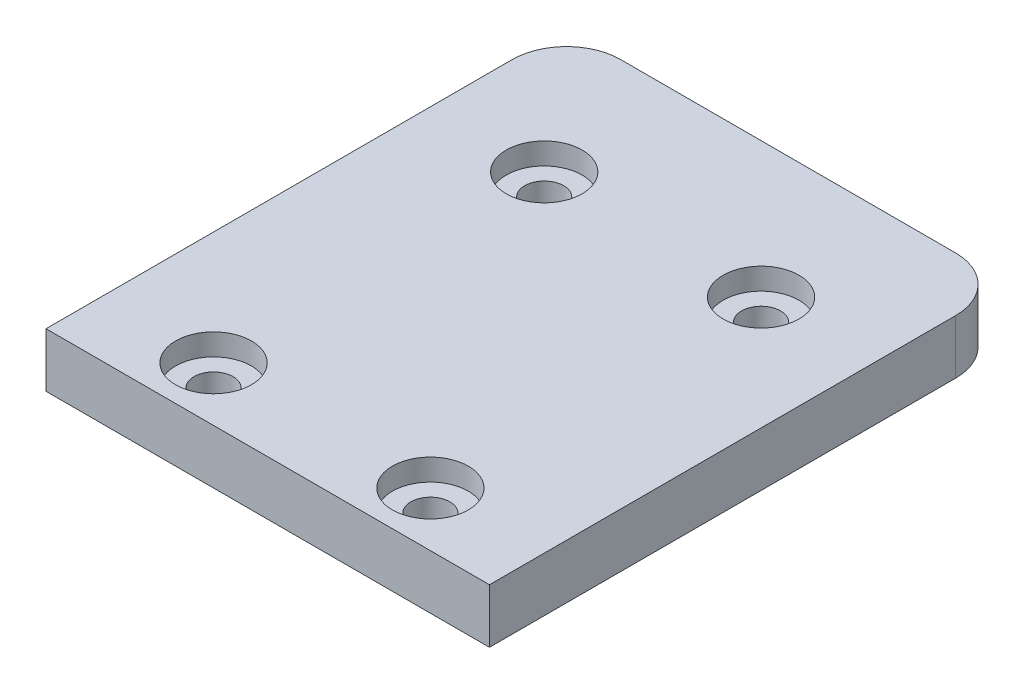
ISO-10303-21;
HEADER;
FILE_DESCRIPTION(('STEP AP214'),'2;1');
FILE_NAME('part.step','',(''),(''),'','','');
FILE_SCHEMA(('AUTOMOTIVE_DESIGN { 1 0 10303 214 1 1 1 1 }'));
ENDSEC;
DATA;
#1=APPLICATION_CONTEXT('core data for automotive mechanical design processes');
#2=APPLICATION_PROTOCOL_DEFINITION('international standard','automotive_design',2000,#1);
#3=PRODUCT_CONTEXT('',#1,'mechanical');
#4=PRODUCT('Part','Part','',(#3));
#5=PRODUCT_RELATED_PRODUCT_CATEGORY('part','',(#4));
#6=PRODUCT_DEFINITION_FORMATION('','',#4);
#7=PRODUCT_DEFINITION_CONTEXT('part definition',#1,'design');
#8=PRODUCT_DEFINITION('design','',#6,#7);
#9=PRODUCT_DEFINITION_SHAPE('','',#8);
#10=(LENGTH_UNIT() NAMED_UNIT(*) SI_UNIT(.MILLI.,.METRE.));
#11=(NAMED_UNIT(*) PLANE_ANGLE_UNIT() SI_UNIT($,.RADIAN.));
#12=(NAMED_UNIT(*) SI_UNIT($,.STERADIAN.) SOLID_ANGLE_UNIT());
#13=UNCERTAINTY_MEASURE_WITH_UNIT(LENGTH_MEASURE(1.E-05),#10,'distance_accuracy_value','');
#14=(GEOMETRIC_REPRESENTATION_CONTEXT(3) GLOBAL_UNCERTAINTY_ASSIGNED_CONTEXT((#13)) GLOBAL_UNIT_ASSIGNED_CONTEXT((#10,
#11,#12)) REPRESENTATION_CONTEXT('',''));
#15=CARTESIAN_POINT('',(0.,0.,0.));
#16=DIRECTION('',(0.,0.,1.));
#17=DIRECTION('',(1.,0.,0.));
#18=AXIS2_PLACEMENT_3D('',#15,#16,#17);
#19=CARTESIAN_POINT('',(0.,0.,-9.));
#20=DIRECTION('',(-1.,0.,0.));
#21=DIRECTION('',(0.,0.,1.));
#22=AXIS2_PLACEMENT_3D('',#19,#20,#21);
#23=PLANE('',#22);
#24=DIRECTION('',(0.,1.,0.));
#25=VECTOR('',#24,1.);
#26=CARTESIAN_POINT('',(0.,0.,32.));
#27=LINE('',#26,#25);
#28=CARTESIAN_POINT('',(0.,0.,32.));
#29=VERTEX_POINT('',#28);
#30=CARTESIAN_POINT('',(0.,5.,32.));
#31=VERTEX_POINT('',#30);
#32=EDGE_CURVE('E121',#29,#31,#27,.T.);
#33=ORIENTED_EDGE('',*,*,#32,.T.);
#34=DIRECTION('',(0.,0.,1.));
#35=VECTOR('',#34,1.);
#36=CARTESIAN_POINT('',(0.,5.,-9.));
#37=LINE('',#36,#35);
#38=CARTESIAN_POINT('',(0.,5.,-11.));
#39=VERTEX_POINT('',#38);
#40=EDGE_CURVE('E102',#39,#31,#37,.T.);
#41=ORIENTED_EDGE('',*,*,#40,.F.);
#42=DIRECTION('',(0.,1.,0.));
#43=VECTOR('',#42,1.);
#44=CARTESIAN_POINT('',(0.,0.,-11.));
#45=LINE('',#44,#43);
#46=CARTESIAN_POINT('',(0.,0.,-11.));
#47=VERTEX_POINT('',#46);
#48=EDGE_CURVE('E11',#39,#47,#45,.F.);
#49=ORIENTED_EDGE('',*,*,#48,.T.);
#50=DIRECTION('',(0.,0.,1.));
#51=VECTOR('',#50,1.);
#52=CARTESIAN_POINT('',(0.,0.,9.));
#53=LINE('',#52,#51);
#54=EDGE_CURVE('E65',#47,#29,#53,.T.);
#55=ORIENTED_EDGE('',*,*,#54,.T.);
#56=EDGE_LOOP('',(#33,#41,#49,#55));
#57=FACE_BOUND('',#56,.T.);
#58=ADVANCED_FACE('F47',(#57),#23,.T.);
#59=CARTESIAN_POINT('',(40.9,0.,-9.));
#60=DIRECTION('',(1.,0.,0.));
#61=DIRECTION('',(0.,1.,0.));
#62=AXIS2_PLACEMENT_3D('',#59,#60,#61);
#63=PLANE('',#62);
#64=DIRECTION('',(0.,0.,1.));
#65=VECTOR('',#64,1.);
#66=CARTESIAN_POINT('',(40.9,5.,-9.));
#67=LINE('',#66,#65);
#68=CARTESIAN_POINT('',(40.9,4.99999999999999,-11.));
#69=VERTEX_POINT('',#68);
#70=CARTESIAN_POINT('',(40.9,4.99999999999999,32.));
#71=VERTEX_POINT('',#70);
#72=EDGE_CURVE('E115',#69,#71,#67,.T.);
#73=ORIENTED_EDGE('',*,*,#72,.T.);
#74=DIRECTION('',(0.,1.,0.));
#75=VECTOR('',#74,1.);
#76=CARTESIAN_POINT('',(40.9,0.,32.));
#77=LINE('',#76,#75);
#78=CARTESIAN_POINT('',(40.9,0.,32.));
#79=VERTEX_POINT('',#78);
#80=EDGE_CURVE('E123',#79,#71,#77,.T.);
#81=ORIENTED_EDGE('',*,*,#80,.F.);
#82=DIRECTION('',(0.,0.,-1.));
#83=VECTOR('',#82,1.);
#84=CARTESIAN_POINT('',(40.9,0.,-9.));
#85=LINE('',#84,#83);
#86=CARTESIAN_POINT('',(40.9,0.,-11.));
#87=VERTEX_POINT('',#86);
#88=EDGE_CURVE('E142',#79,#87,#85,.T.);
#89=ORIENTED_EDGE('',*,*,#88,.T.);
#90=DIRECTION('',(0.,1.,0.));
#91=VECTOR('',#90,1.);
#92=CARTESIAN_POINT('',(40.9,0.,-11.));
#93=LINE('',#92,#91);
#94=EDGE_CURVE('E114',#87,#69,#93,.T.);
#95=ORIENTED_EDGE('',*,*,#94,.T.);
#96=EDGE_LOOP('',(#73,#81,#89,#95));
#97=FACE_BOUND('',#96,.T.);
#98=ADVANCED_FACE('F263',(#97),#63,.T.);
#99=CARTESIAN_POINT('',(0.,0.,32.));
#100=DIRECTION('',(0.,0.,1.));
#101=DIRECTION('',(1.,0.,0.));
#102=AXIS2_PLACEMENT_3D('',#99,#100,#101);
#103=PLANE('',#102);
#104=ORIENTED_EDGE('',*,*,#80,.T.);
#105=DIRECTION('',(1.,0.,0.));
#106=VECTOR('',#105,1.);
#107=CARTESIAN_POINT('',(40.9,4.99999999999999,32.));
#108=LINE('',#107,#106);
#109=EDGE_CURVE('E106',#31,#71,#108,.T.);
#110=ORIENTED_EDGE('',*,*,#109,.F.);
#111=ORIENTED_EDGE('',*,*,#32,.F.);
#112=DIRECTION('',(1.,0.,0.));
#113=VECTOR('',#112,1.);
#114=CARTESIAN_POINT('',(0.,0.,32.));
#115=LINE('',#114,#113);
#116=EDGE_CURVE('E128',#29,#79,#115,.T.);
#117=ORIENTED_EDGE('',*,*,#116,.T.);
#118=EDGE_LOOP('',(#104,#110,#111,#117));
#119=FACE_BOUND('',#118,.T.);
#120=ADVANCED_FACE('F119',(#119),#103,.T.);
#121=CARTESIAN_POINT('',(10.45,3.,27.));
#122=DIRECTION('',(0.,1.,0.));
#123=DIRECTION('',(-1.,0.,0.));
#124=AXIS2_PLACEMENT_3D('',#121,#122,#123);
#125=CYLINDRICAL_SURFACE('',#124,3.5);
#126=CARTESIAN_POINT('',(10.45,3.,27.));
#127=DIRECTION('',(0.,1.,0.));
#128=DIRECTION('',(-1.,0.,0.));
#129=AXIS2_PLACEMENT_3D('',#126,#127,#128);
#130=CIRCLE('',#129,3.5);
#131=CARTESIAN_POINT('',(6.95,3.,27.));
#132=VERTEX_POINT('',#131);
#133=EDGE_CURVE('E194',#132,#132,#130,.T.);
#134=ORIENTED_EDGE('',*,*,#133,.F.);
#135=EDGE_LOOP('',(#134));
#136=FACE_BOUND('',#135,.T.);
#137=CARTESIAN_POINT('',(10.45,5.,27.));
#138=DIRECTION('',(0.,1.,0.));
#139=DIRECTION('',(-1.,0.,0.));
#140=AXIS2_PLACEMENT_3D('',#137,#138,#139);
#141=CIRCLE('',#140,3.5);
#142=CARTESIAN_POINT('',(6.95,5.,27.));
#143=VERTEX_POINT('',#142);
#144=EDGE_CURVE('E125',#143,#143,#141,.F.);
#145=ORIENTED_EDGE('',*,*,#144,.F.);
#146=EDGE_LOOP('',(#145));
#147=FACE_BOUND('',#146,.T.);
#148=ADVANCED_FACE('F254',(#136,#147),#125,.F.);
#149=CARTESIAN_POINT('',(10.45,3.,27.));
#150=DIRECTION('',(0.,1.,0.));
#151=DIRECTION('',(-1.,0.,0.));
#152=AXIS2_PLACEMENT_3D('',#149,#150,#151);
#153=PLANE('',#152);
#154=CARTESIAN_POINT('',(10.45,3.,27.));
#155=DIRECTION('',(0.,1.,0.));
#156=DIRECTION('',(-1.,0.,0.));
#157=AXIS2_PLACEMENT_3D('',#154,#155,#156);
#158=CIRCLE('',#157,1.8);
#159=CARTESIAN_POINT('',(8.65,3.,27.));
#160=VERTEX_POINT('',#159);
#161=EDGE_CURVE('E176',#160,#160,#158,.T.);
#162=ORIENTED_EDGE('',*,*,#161,.F.);
#163=EDGE_LOOP('',(#162));
#164=FACE_BOUND('',#163,.T.);
#165=ORIENTED_EDGE('',*,*,#133,.T.);
#166=EDGE_LOOP('',(#165));
#167=FACE_BOUND('',#166,.T.);
#168=ADVANCED_FACE('F251',(#164,#167),#153,.T.);
#169=CARTESIAN_POINT('',(10.45,-1.73472347597681E-13,27.));
#170=DIRECTION('',(0.,1.,0.));
#171=DIRECTION('',(-1.,0.,0.));
#172=AXIS2_PLACEMENT_3D('',#169,#170,#171);
#173=CYLINDRICAL_SURFACE('',#172,1.8);
#174=ORIENTED_EDGE('',*,*,#161,.T.);
#175=EDGE_LOOP('',(#174));
#176=FACE_BOUND('',#175,.T.);
#177=CARTESIAN_POINT('',(10.45,-1.73472347597681E-13,27.));
#178=DIRECTION('',(0.,1.,0.));
#179=DIRECTION('',(-1.,0.,0.));
#180=AXIS2_PLACEMENT_3D('',#177,#178,#179);
#181=CIRCLE('',#180,1.8);
#182=CARTESIAN_POINT('',(8.65000000000001,-1.79717352111197E-13,27.));
#183=VERTEX_POINT('',#182);
#184=EDGE_CURVE('E228',#183,#183,#181,.T.);
#185=ORIENTED_EDGE('',*,*,#184,.F.);
#186=EDGE_LOOP('',(#185));
#187=FACE_BOUND('',#186,.T.);
#188=ADVANCED_FACE('F221',(#176,#187),#173,.F.);
#189=CARTESIAN_POINT('',(0.,5.,-9.));
#190=DIRECTION('',(0.,-1.,0.));
#191=DIRECTION('',(1.,0.,0.));
#192=AXIS2_PLACEMENT_3D('',#189,#190,#191);
#193=PLANE('',#192);
#194=CARTESIAN_POINT('',(30.45,4.99999999999999,27.));
#195=DIRECTION('',(0.,1.,0.));
#196=DIRECTION('',(-1.,0.,0.));
#197=AXIS2_PLACEMENT_3D('',#194,#195,#196);
#198=CIRCLE('',#197,3.5);
#199=CARTESIAN_POINT('',(26.95,5.,27.));
#200=VERTEX_POINT('',#199);
#201=EDGE_CURVE('E188',#200,#200,#198,.T.);
#202=ORIENTED_EDGE('',*,*,#201,.F.);
#203=EDGE_LOOP('',(#202));
#204=FACE_BOUND('',#203,.T.);
#205=ORIENTED_EDGE('',*,*,#109,.T.);
#206=ORIENTED_EDGE('',*,*,#72,.F.);
#207=CARTESIAN_POINT('',(35.9,4.99999999999999,-11.));
#208=DIRECTION('',(0.,-1.,0.));
#209=DIRECTION('',(1.,0.,0.));
#210=AXIS2_PLACEMENT_3D('',#207,#208,#209);
#211=CIRCLE('',#210,5.);
#212=CARTESIAN_POINT('',(35.9,4.99999999999999,-16.));
#213=VERTEX_POINT('',#212);
#214=EDGE_CURVE('E158',#69,#213,#211,.F.);
#215=ORIENTED_EDGE('',*,*,#214,.T.);
#216=DIRECTION('',(-1.,0.,0.));
#217=VECTOR('',#216,1.);
#218=CARTESIAN_POINT('',(0.,5.,-16.));
#219=LINE('',#218,#217);
#220=CARTESIAN_POINT('',(5.00000000000001,5.,-16.));
#221=VERTEX_POINT('',#220);
#222=EDGE_CURVE('E141',#213,#221,#219,.T.);
#223=ORIENTED_EDGE('',*,*,#222,.T.);
#224=CARTESIAN_POINT('',(5.00000000000001,5.,-11.));
#225=DIRECTION('',(0.,-1.,0.));
#226=DIRECTION('',(1.,0.,0.));
#227=AXIS2_PLACEMENT_3D('',#224,#225,#226);
#228=CIRCLE('',#227,5.);
#229=EDGE_CURVE('E109',#221,#39,#228,.F.);
#230=ORIENTED_EDGE('',*,*,#229,.T.);
#231=ORIENTED_EDGE('',*,*,#40,.T.);
#232=EDGE_LOOP('',(#205,#206,#215,#223,#230,#231));
#233=FACE_BOUND('',#232,.T.);
#234=CARTESIAN_POINT('',(30.45,4.99999999999999,-3.5));
#235=DIRECTION('',(0.,1.,0.));
#236=DIRECTION('',(-1.,0.,0.));
#237=AXIS2_PLACEMENT_3D('',#234,#235,#236);
#238=CIRCLE('',#237,3.5);
#239=CARTESIAN_POINT('',(26.95,5.,-3.5));
#240=VERTEX_POINT('',#239);
#241=EDGE_CURVE('E198',#240,#240,#238,.T.);
#242=ORIENTED_EDGE('',*,*,#241,.F.);
#243=EDGE_LOOP('',(#242));
#244=FACE_BOUND('',#243,.T.);
#245=CARTESIAN_POINT('',(10.45,5.,-3.5));
#246=DIRECTION('',(0.,1.,0.));
#247=DIRECTION('',(-1.,0.,0.));
#248=AXIS2_PLACEMENT_3D('',#245,#246,#247);
#249=CIRCLE('',#248,3.5);
#250=CARTESIAN_POINT('',(6.95,5.,-3.5));
#251=VERTEX_POINT('',#250);
#252=EDGE_CURVE('E136',#251,#251,#249,.T.);
#253=ORIENTED_EDGE('',*,*,#252,.F.);
#254=EDGE_LOOP('',(#253));
#255=FACE_BOUND('',#254,.T.);
#256=ORIENTED_EDGE('',*,*,#144,.T.);
#257=EDGE_LOOP('',(#256));
#258=FACE_BOUND('',#257,.T.);
#259=ADVANCED_FACE('F104',(#204,#233,#244,#255,#258),#193,.F.);
#260=CARTESIAN_POINT('',(0.,0.,-9.));
#261=DIRECTION('',(0.,-1.,0.));
#262=DIRECTION('',(1.,0.,0.));
#263=AXIS2_PLACEMENT_3D('',#260,#261,#262);
#264=PLANE('',#263);
#265=ORIENTED_EDGE('',*,*,#54,.F.);
#266=CARTESIAN_POINT('',(5.00000000000001,0.,-11.));
#267=DIRECTION('',(0.,-1.,0.));
#268=DIRECTION('',(1.,0.,0.));
#269=AXIS2_PLACEMENT_3D('',#266,#267,#268);
#270=CIRCLE('',#269,5.);
#271=CARTESIAN_POINT('',(5.00000000000001,0.,-16.));
#272=VERTEX_POINT('',#271);
#273=EDGE_CURVE('E69',#47,#272,#270,.T.);
#274=ORIENTED_EDGE('',*,*,#273,.T.);
#275=DIRECTION('',(-1.,0.,0.));
#276=VECTOR('',#275,1.);
#277=CARTESIAN_POINT('',(0.,0.,-16.));
#278=LINE('',#277,#276);
#279=CARTESIAN_POINT('',(35.9,0.,-16.));
#280=VERTEX_POINT('',#279);
#281=EDGE_CURVE('E146',#280,#272,#278,.T.);
#282=ORIENTED_EDGE('',*,*,#281,.F.);
#283=CARTESIAN_POINT('',(35.9,0.,-11.));
#284=DIRECTION('',(0.,-1.,0.));
#285=DIRECTION('',(1.,0.,0.));
#286=AXIS2_PLACEMENT_3D('',#283,#284,#285);
#287=CIRCLE('',#286,5.);
#288=EDGE_CURVE('E57',#280,#87,#287,.T.);
#289=ORIENTED_EDGE('',*,*,#288,.T.);
#290=ORIENTED_EDGE('',*,*,#88,.F.);
#291=ORIENTED_EDGE('',*,*,#116,.F.);
#292=EDGE_LOOP('',(#265,#274,#282,#289,#290,#291));
#293=FACE_BOUND('',#292,.T.);
#294=ORIENTED_EDGE('',*,*,#184,.T.);
#295=EDGE_LOOP('',(#294));
#296=FACE_BOUND('',#295,.T.);
#297=CARTESIAN_POINT('',(10.45,-1.73472347597681E-13,-3.5));
#298=DIRECTION('',(0.,1.,0.));
#299=DIRECTION('',(-1.,0.,0.));
#300=AXIS2_PLACEMENT_3D('',#297,#298,#299);
#301=CIRCLE('',#300,1.8);
#302=CARTESIAN_POINT('',(8.65000000000001,-1.79717352111197E-13,-3.5));
#303=VERTEX_POINT('',#302);
#304=EDGE_CURVE('E239',#303,#303,#301,.T.);
#305=ORIENTED_EDGE('',*,*,#304,.T.);
#306=EDGE_LOOP('',(#305));
#307=FACE_BOUND('',#306,.T.);
#308=CARTESIAN_POINT('',(30.45,-1.04083408558608E-13,-3.5));
#309=DIRECTION('',(0.,1.,0.));
#310=DIRECTION('',(-1.,0.,0.));
#311=AXIS2_PLACEMENT_3D('',#308,#309,#310);
#312=CIRCLE('',#311,1.8);
#313=CARTESIAN_POINT('',(28.65,-1.10328413072125E-13,-3.5));
#314=VERTEX_POINT('',#313);
#315=EDGE_CURVE('E235',#314,#314,#312,.T.);
#316=ORIENTED_EDGE('',*,*,#315,.T.);
#317=EDGE_LOOP('',(#316));
#318=FACE_BOUND('',#317,.T.);
#319=CARTESIAN_POINT('',(30.45,-1.04083408558608E-13,27.));
#320=DIRECTION('',(0.,1.,0.));
#321=DIRECTION('',(-1.,0.,0.));
#322=AXIS2_PLACEMENT_3D('',#319,#320,#321);
#323=CIRCLE('',#322,1.8);
#324=CARTESIAN_POINT('',(28.65,-1.10328413072125E-13,27.));
#325=VERTEX_POINT('',#324);
#326=EDGE_CURVE('E232',#325,#325,#323,.T.);
#327=ORIENTED_EDGE('',*,*,#326,.T.);
#328=EDGE_LOOP('',(#327));
#329=FACE_BOUND('',#328,.T.);
#330=ADVANCED_FACE('F220',(#293,#296,#307,#318,#329),#264,.T.);
#331=CARTESIAN_POINT('',(0.,0.,-16.));
#332=DIRECTION('',(0.,0.,-1.));
#333=DIRECTION('',(-1.,0.,0.));
#334=AXIS2_PLACEMENT_3D('',#331,#332,#333);
#335=PLANE('',#334);
#336=ORIENTED_EDGE('',*,*,#222,.F.);
#337=DIRECTION('',(0.,1.,0.));
#338=VECTOR('',#337,1.);
#339=CARTESIAN_POINT('',(35.9,0.,-16.));
#340=LINE('',#339,#338);
#341=EDGE_CURVE('E165',#213,#280,#340,.F.);
#342=ORIENTED_EDGE('',*,*,#341,.T.);
#343=ORIENTED_EDGE('',*,*,#281,.T.);
#344=DIRECTION('',(0.,1.,0.));
#345=VECTOR('',#344,1.);
#346=CARTESIAN_POINT('',(5.00000000000001,0.,-16.));
#347=LINE('',#346,#345);
#348=EDGE_CURVE('E161',#272,#221,#347,.T.);
#349=ORIENTED_EDGE('',*,*,#348,.T.);
#350=EDGE_LOOP('',(#336,#342,#343,#349));
#351=FACE_BOUND('',#350,.T.);
#352=ADVANCED_FACE('F276',(#351),#335,.T.);
#353=CARTESIAN_POINT('',(35.9,0.,-11.));
#354=DIRECTION('',(0.,1.,0.));
#355=DIRECTION('',(-1.,0.,0.));
#356=AXIS2_PLACEMENT_3D('',#353,#354,#355);
#357=CYLINDRICAL_SURFACE('',#356,5.);
#358=ORIENTED_EDGE('',*,*,#288,.F.);
#359=ORIENTED_EDGE('',*,*,#341,.F.);
#360=ORIENTED_EDGE('',*,*,#214,.F.);
#361=ORIENTED_EDGE('',*,*,#94,.F.);
#362=EDGE_LOOP('',(#358,#359,#360,#361));
#363=FACE_BOUND('',#362,.T.);
#364=ADVANCED_FACE('F277',(#363),#357,.T.);
#365=CARTESIAN_POINT('',(5.00000000000001,0.,-11.));
#366=DIRECTION('',(0.,1.,0.));
#367=DIRECTION('',(-1.,0.,0.));
#368=AXIS2_PLACEMENT_3D('',#365,#366,#367);
#369=CYLINDRICAL_SURFACE('',#368,5.);
#370=ORIENTED_EDGE('',*,*,#273,.F.);
#371=ORIENTED_EDGE('',*,*,#48,.F.);
#372=ORIENTED_EDGE('',*,*,#229,.F.);
#373=ORIENTED_EDGE('',*,*,#348,.F.);
#374=EDGE_LOOP('',(#370,#371,#372,#373));
#375=FACE_BOUND('',#374,.T.);
#376=ADVANCED_FACE('F49',(#375),#369,.T.);
#377=CARTESIAN_POINT('',(30.45,2.99999999999999,27.));
#378=DIRECTION('',(0.,1.,0.));
#379=DIRECTION('',(-1.,0.,0.));
#380=AXIS2_PLACEMENT_3D('',#377,#378,#379);
#381=CYLINDRICAL_SURFACE('',#380,3.5);
#382=CARTESIAN_POINT('',(30.45,2.99999999999999,27.));
#383=DIRECTION('',(0.,1.,0.));
#384=DIRECTION('',(-1.,0.,0.));
#385=AXIS2_PLACEMENT_3D('',#382,#383,#384);
#386=CIRCLE('',#385,3.5);
#387=CARTESIAN_POINT('',(26.95,3.,27.));
#388=VERTEX_POINT('',#387);
#389=EDGE_CURVE('E183',#388,#388,#386,.T.);
#390=ORIENTED_EDGE('',*,*,#389,.F.);
#391=EDGE_LOOP('',(#390));
#392=FACE_BOUND('',#391,.T.);
#393=ORIENTED_EDGE('',*,*,#201,.T.);
#394=EDGE_LOOP('',(#393));
#395=FACE_BOUND('',#394,.T.);
#396=ADVANCED_FACE('F284',(#392,#395),#381,.F.);
#397=CARTESIAN_POINT('',(30.45,2.99999999999999,27.));
#398=DIRECTION('',(0.,1.,0.));
#399=DIRECTION('',(-1.,0.,0.));
#400=AXIS2_PLACEMENT_3D('',#397,#398,#399);
#401=PLANE('',#400);
#402=CARTESIAN_POINT('',(30.45,2.99999999999999,27.));
#403=DIRECTION('',(0.,1.,0.));
#404=DIRECTION('',(-1.,0.,0.));
#405=AXIS2_PLACEMENT_3D('',#402,#403,#404);
#406=CIRCLE('',#405,1.8);
#407=CARTESIAN_POINT('',(28.65,3.,27.));
#408=VERTEX_POINT('',#407);
#409=EDGE_CURVE('E51',#408,#408,#406,.T.);
#410=ORIENTED_EDGE('',*,*,#409,.F.);
#411=EDGE_LOOP('',(#410));
#412=FACE_BOUND('',#411,.T.);
#413=ORIENTED_EDGE('',*,*,#389,.T.);
#414=EDGE_LOOP('',(#413));
#415=FACE_BOUND('',#414,.T.);
#416=ADVANCED_FACE('F316',(#412,#415),#401,.T.);
#417=CARTESIAN_POINT('',(10.45,3.,-3.5));
#418=DIRECTION('',(0.,1.,0.));
#419=DIRECTION('',(-1.,0.,0.));
#420=AXIS2_PLACEMENT_3D('',#417,#418,#419);
#421=CYLINDRICAL_SURFACE('',#420,3.5);
#422=CARTESIAN_POINT('',(10.45,3.,-3.5));
#423=DIRECTION('',(0.,1.,0.));
#424=DIRECTION('',(-1.,0.,0.));
#425=AXIS2_PLACEMENT_3D('',#422,#423,#424);
#426=CIRCLE('',#425,3.5);
#427=CARTESIAN_POINT('',(6.95,3.,-3.5));
#428=VERTEX_POINT('',#427);
#429=EDGE_CURVE('E133',#428,#428,#426,.T.);
#430=ORIENTED_EDGE('',*,*,#429,.F.);
#431=EDGE_LOOP('',(#430));
#432=FACE_BOUND('',#431,.T.);
#433=ORIENTED_EDGE('',*,*,#252,.T.);
#434=EDGE_LOOP('',(#433));
#435=FACE_BOUND('',#434,.T.);
#436=ADVANCED_FACE('F216',(#432,#435),#421,.F.);
#437=CARTESIAN_POINT('',(10.45,3.,-3.5));
#438=DIRECTION('',(0.,1.,0.));
#439=DIRECTION('',(-1.,0.,0.));
#440=AXIS2_PLACEMENT_3D('',#437,#438,#439);
#441=PLANE('',#440);
#442=CARTESIAN_POINT('',(10.45,3.,-3.5));
#443=DIRECTION('',(0.,1.,0.));
#444=DIRECTION('',(-1.,0.,0.));
#445=AXIS2_PLACEMENT_3D('',#442,#443,#444);
#446=CIRCLE('',#445,1.8);
#447=CARTESIAN_POINT('',(8.65000000000001,3.,-3.5));
#448=VERTEX_POINT('',#447);
#449=EDGE_CURVE('E175',#448,#448,#446,.T.);
#450=ORIENTED_EDGE('',*,*,#449,.F.);
#451=EDGE_LOOP('',(#450));
#452=FACE_BOUND('',#451,.T.);
#453=ORIENTED_EDGE('',*,*,#429,.T.);
#454=EDGE_LOOP('',(#453));
#455=FACE_BOUND('',#454,.T.);
#456=ADVANCED_FACE('F324',(#452,#455),#441,.T.);
#457=CARTESIAN_POINT('',(30.45,2.99999999999999,-3.5));
#458=DIRECTION('',(0.,1.,0.));
#459=DIRECTION('',(-1.,0.,0.));
#460=AXIS2_PLACEMENT_3D('',#457,#458,#459);
#461=CYLINDRICAL_SURFACE('',#460,3.5);
#462=CARTESIAN_POINT('',(30.45,2.99999999999999,-3.5));
#463=DIRECTION('',(0.,1.,0.));
#464=DIRECTION('',(-1.,0.,0.));
#465=AXIS2_PLACEMENT_3D('',#462,#463,#464);
#466=CIRCLE('',#465,3.5);
#467=CARTESIAN_POINT('',(26.95,3.,-3.5));
#468=VERTEX_POINT('',#467);
#469=EDGE_CURVE('E202',#468,#468,#466,.T.);
#470=ORIENTED_EDGE('',*,*,#469,.F.);
#471=EDGE_LOOP('',(#470));
#472=FACE_BOUND('',#471,.T.);
#473=ORIENTED_EDGE('',*,*,#241,.T.);
#474=EDGE_LOOP('',(#473));
#475=FACE_BOUND('',#474,.T.);
#476=ADVANCED_FACE('F321',(#472,#475),#461,.F.);
#477=CARTESIAN_POINT('',(30.45,2.99999999999999,-3.5));
#478=DIRECTION('',(0.,1.,0.));
#479=DIRECTION('',(-1.,0.,0.));
#480=AXIS2_PLACEMENT_3D('',#477,#478,#479);
#481=PLANE('',#480);
#482=CARTESIAN_POINT('',(30.45,2.99999999999999,-3.5));
#483=DIRECTION('',(0.,1.,0.));
#484=DIRECTION('',(-1.,0.,0.));
#485=AXIS2_PLACEMENT_3D('',#482,#483,#484);
#486=CIRCLE('',#485,1.8);
#487=CARTESIAN_POINT('',(28.65,3.,-3.5));
#488=VERTEX_POINT('',#487);
#489=EDGE_CURVE('E172',#488,#488,#486,.T.);
#490=ORIENTED_EDGE('',*,*,#489,.F.);
#491=EDGE_LOOP('',(#490));
#492=FACE_BOUND('',#491,.T.);
#493=ORIENTED_EDGE('',*,*,#469,.T.);
#494=EDGE_LOOP('',(#493));
#495=FACE_BOUND('',#494,.T.);
#496=ADVANCED_FACE('F323',(#492,#495),#481,.T.);
#497=CARTESIAN_POINT('',(30.45,-1.04083408558608E-13,-3.5));
#498=DIRECTION('',(0.,1.,0.));
#499=DIRECTION('',(-1.,0.,0.));
#500=AXIS2_PLACEMENT_3D('',#497,#498,#499);
#501=CYLINDRICAL_SURFACE('',#500,1.8);
#502=ORIENTED_EDGE('',*,*,#489,.T.);
#503=EDGE_LOOP('',(#502));
#504=FACE_BOUND('',#503,.T.);
#505=ORIENTED_EDGE('',*,*,#315,.F.);
#506=EDGE_LOOP('',(#505));
#507=FACE_BOUND('',#506,.T.);
#508=ADVANCED_FACE('F309',(#504,#507),#501,.F.);
#509=CARTESIAN_POINT('',(10.45,-1.73472347597681E-13,-3.5));
#510=DIRECTION('',(0.,1.,0.));
#511=DIRECTION('',(-1.,0.,0.));
#512=AXIS2_PLACEMENT_3D('',#509,#510,#511);
#513=CYLINDRICAL_SURFACE('',#512,1.8);
#514=ORIENTED_EDGE('',*,*,#449,.T.);
#515=EDGE_LOOP('',(#514));
#516=FACE_BOUND('',#515,.T.);
#517=ORIENTED_EDGE('',*,*,#304,.F.);
#518=EDGE_LOOP('',(#517));
#519=FACE_BOUND('',#518,.T.);
#520=ADVANCED_FACE('F304',(#516,#519),#513,.F.);
#521=CARTESIAN_POINT('',(30.45,-1.04083408558608E-13,27.));
#522=DIRECTION('',(0.,1.,0.));
#523=DIRECTION('',(-1.,0.,0.));
#524=AXIS2_PLACEMENT_3D('',#521,#522,#523);
#525=CYLINDRICAL_SURFACE('',#524,1.8);
#526=ORIENTED_EDGE('',*,*,#409,.T.);
#527=EDGE_LOOP('',(#526));
#528=FACE_BOUND('',#527,.T.);
#529=ORIENTED_EDGE('',*,*,#326,.F.);
#530=EDGE_LOOP('',(#529));
#531=FACE_BOUND('',#530,.T.);
#532=ADVANCED_FACE('F302',(#528,#531),#525,.F.);
#533=CLOSED_SHELL('',(#58,#98,#120,#148,#168,#188,#259,#330,#352,#364,#376,#396,#416,#436,#456,
#476,#496,#508,#520,#532));
#534=MANIFOLD_SOLID_BREP('B2',#533);
#535=ADVANCED_BREP_SHAPE_REPRESENTATION('',(#18,#534),#14);
#536=SHAPE_DEFINITION_REPRESENTATION(#9,#535);
ENDSEC;
END-ISO-10303-21;
